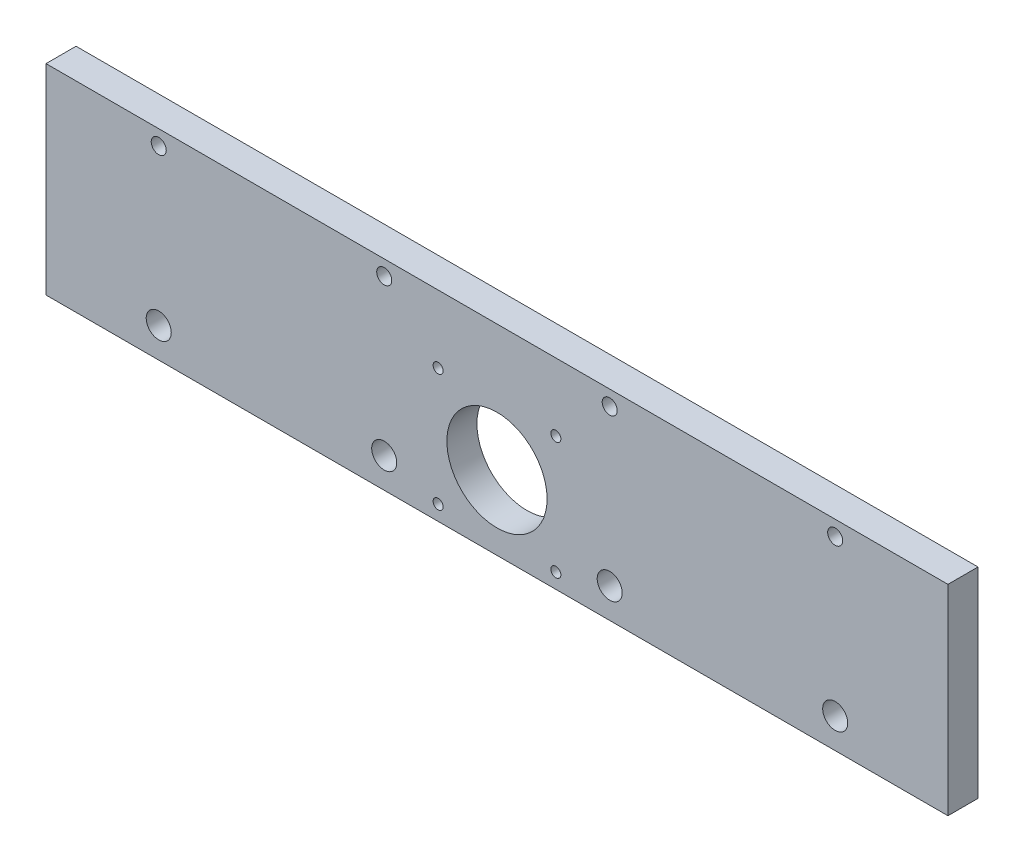
ISO-10303-21;
HEADER;
FILE_DESCRIPTION(('STEP AP214'),'2;1');
FILE_NAME('part.step','',(''),(''),'','','');
FILE_SCHEMA(('AUTOMOTIVE_DESIGN { 1 0 10303 214 1 1 1 1 }'));
ENDSEC;
DATA;
#1=APPLICATION_CONTEXT('core data for automotive mechanical design processes');
#2=APPLICATION_PROTOCOL_DEFINITION('international standard','automotive_design',2000,#1);
#3=PRODUCT_CONTEXT('',#1,'mechanical');
#4=PRODUCT('Part','Part','',(#3));
#5=PRODUCT_RELATED_PRODUCT_CATEGORY('part','',(#4));
#6=PRODUCT_DEFINITION_FORMATION('','',#4);
#7=PRODUCT_DEFINITION_CONTEXT('part definition',#1,'design');
#8=PRODUCT_DEFINITION('design','',#6,#7);
#9=PRODUCT_DEFINITION_SHAPE('','',#8);
#10=(LENGTH_UNIT() NAMED_UNIT(*) SI_UNIT(.MILLI.,.METRE.));
#11=(NAMED_UNIT(*) PLANE_ANGLE_UNIT() SI_UNIT($,.RADIAN.));
#12=(NAMED_UNIT(*) SI_UNIT($,.STERADIAN.) SOLID_ANGLE_UNIT());
#13=UNCERTAINTY_MEASURE_WITH_UNIT(LENGTH_MEASURE(1.E-05),#10,'distance_accuracy_value','');
#14=(GEOMETRIC_REPRESENTATION_CONTEXT(3) GLOBAL_UNCERTAINTY_ASSIGNED_CONTEXT((#13)) GLOBAL_UNIT_ASSIGNED_CONTEXT((#10,
#11,#12)) REPRESENTATION_CONTEXT('',''));
#15=CARTESIAN_POINT('',(0.,0.,0.));
#16=DIRECTION('',(0.,0.,1.));
#17=DIRECTION('',(1.,0.,0.));
#18=AXIS2_PLACEMENT_3D('',#15,#16,#17);
#19=CARTESIAN_POINT('',(180.,40.,12.));
#20=DIRECTION('',(0.,0.,-1.));
#21=DIRECTION('',(-1.,0.,0.));
#22=AXIS2_PLACEMENT_3D('',#19,#20,#21);
#23=PLANE('',#22);
#24=CARTESIAN_POINT('',(23.5,13.,12.));
#25=DIRECTION('',(0.,0.,-1.));
#26=DIRECTION('',(-1.,0.,0.));
#27=AXIS2_PLACEMENT_3D('',#24,#25,#26);
#28=CIRCLE('',#27,2.);
#29=CARTESIAN_POINT('',(21.5,13.,12.));
#30=VERTEX_POINT('',#29);
#31=EDGE_CURVE('E150',#30,#30,#28,.T.);
#32=ORIENTED_EDGE('',*,*,#31,.T.);
#33=EDGE_LOOP('',(#32));
#34=FACE_BOUND('',#33,.T.);
#35=CARTESIAN_POINT('',(-23.5,-34.,12.));
#36=DIRECTION('',(0.,0.,1.));
#37=DIRECTION('',(1.,0.,0.));
#38=AXIS2_PLACEMENT_3D('',#35,#36,#37);
#39=CIRCLE('',#38,2.00000000000001);
#40=CARTESIAN_POINT('',(-21.5,-34.,12.));
#41=VERTEX_POINT('',#40);
#42=EDGE_CURVE('E159',#41,#41,#39,.T.);
#43=ORIENTED_EDGE('',*,*,#42,.F.);
#44=EDGE_LOOP('',(#43));
#45=FACE_BOUND('',#44,.T.);
#46=CARTESIAN_POINT('',(-23.5,13.,12.));
#47=DIRECTION('',(0.,0.,1.));
#48=DIRECTION('',(1.,0.,0.));
#49=AXIS2_PLACEMENT_3D('',#46,#47,#48);
#50=CIRCLE('',#49,2.);
#51=CARTESIAN_POINT('',(-21.5,13.,12.));
#52=VERTEX_POINT('',#51);
#53=EDGE_CURVE('E165',#52,#52,#50,.T.);
#54=ORIENTED_EDGE('',*,*,#53,.F.);
#55=EDGE_LOOP('',(#54));
#56=FACE_BOUND('',#55,.T.);
#57=CARTESIAN_POINT('',(0.,-10.5,12.));
#58=DIRECTION('',(0.,0.,1.));
#59=DIRECTION('',(1.,0.,0.));
#60=AXIS2_PLACEMENT_3D('',#57,#58,#59);
#61=CIRCLE('',#60,20.);
#62=CARTESIAN_POINT('',(20.,-10.5,12.));
#63=VERTEX_POINT('',#62);
#64=EDGE_CURVE('E171',#63,#63,#61,.T.);
#65=ORIENTED_EDGE('',*,*,#64,.F.);
#66=EDGE_LOOP('',(#65));
#67=FACE_BOUND('',#66,.T.);
#68=CARTESIAN_POINT('',(45.,34.,12.));
#69=DIRECTION('',(0.,0.,1.));
#70=DIRECTION('',(1.,0.,0.));
#71=AXIS2_PLACEMENT_3D('',#68,#69,#70);
#72=CIRCLE('',#71,2.99999999999999);
#73=CARTESIAN_POINT('',(48.,34.,12.));
#74=VERTEX_POINT('',#73);
#75=EDGE_CURVE('E179',#74,#74,#72,.T.);
#76=ORIENTED_EDGE('',*,*,#75,.F.);
#77=EDGE_LOOP('',(#76));
#78=FACE_BOUND('',#77,.T.);
#79=CARTESIAN_POINT('',(45.,-28.,12.));
#80=DIRECTION('',(0.,0.,1.));
#81=DIRECTION('',(1.,0.,0.));
#82=AXIS2_PLACEMENT_3D('',#79,#80,#81);
#83=CIRCLE('',#82,4.99999999999999);
#84=CARTESIAN_POINT('',(50.,-28.,12.));
#85=VERTEX_POINT('',#84);
#86=EDGE_CURVE('E185',#85,#85,#83,.T.);
#87=ORIENTED_EDGE('',*,*,#86,.F.);
#88=EDGE_LOOP('',(#87));
#89=FACE_BOUND('',#88,.T.);
#90=CARTESIAN_POINT('',(135.,-28.,12.));
#91=DIRECTION('',(0.,0.,1.));
#92=DIRECTION('',(1.,0.,0.));
#93=AXIS2_PLACEMENT_3D('',#90,#91,#92);
#94=CIRCLE('',#93,4.99999999999999);
#95=CARTESIAN_POINT('',(140.,-28.,12.));
#96=VERTEX_POINT('',#95);
#97=EDGE_CURVE('E189',#96,#96,#94,.T.);
#98=ORIENTED_EDGE('',*,*,#97,.F.);
#99=EDGE_LOOP('',(#98));
#100=FACE_BOUND('',#99,.T.);
#101=CARTESIAN_POINT('',(135.,34.,12.));
#102=DIRECTION('',(0.,0.,1.));
#103=DIRECTION('',(1.,0.,0.));
#104=AXIS2_PLACEMENT_3D('',#101,#102,#103);
#105=CIRCLE('',#104,2.99999999999999);
#106=CARTESIAN_POINT('',(138.,34.,12.));
#107=VERTEX_POINT('',#106);
#108=EDGE_CURVE('E103',#107,#107,#105,.T.);
#109=ORIENTED_EDGE('',*,*,#108,.F.);
#110=EDGE_LOOP('',(#109));
#111=FACE_BOUND('',#110,.T.);
#112=DIRECTION('',(0.,1.,0.));
#113=VECTOR('',#112,1.);
#114=CARTESIAN_POINT('',(180.,-40.,12.));
#115=LINE('',#114,#113);
#116=CARTESIAN_POINT('',(180.,-40.,12.));
#117=VERTEX_POINT('',#116);
#118=CARTESIAN_POINT('',(180.,40.,12.));
#119=VERTEX_POINT('',#118);
#120=EDGE_CURVE('E85',#117,#119,#115,.T.);
#121=ORIENTED_EDGE('',*,*,#120,.T.);
#122=DIRECTION('',(-1.,0.,0.));
#123=VECTOR('',#122,1.);
#124=CARTESIAN_POINT('',(-180.,40.,12.));
#125=LINE('',#124,#123);
#126=CARTESIAN_POINT('',(-180.,40.,12.));
#127=VERTEX_POINT('',#126);
#128=EDGE_CURVE('E80',#119,#127,#125,.T.);
#129=ORIENTED_EDGE('',*,*,#128,.T.);
#130=DIRECTION('',(0.,-1.,0.));
#131=VECTOR('',#130,1.);
#132=CARTESIAN_POINT('',(-180.,-40.,12.));
#133=LINE('',#132,#131);
#134=CARTESIAN_POINT('',(-180.,-40.,12.));
#135=VERTEX_POINT('',#134);
#136=EDGE_CURVE('E83',#127,#135,#133,.T.);
#137=ORIENTED_EDGE('',*,*,#136,.T.);
#138=DIRECTION('',(1.,0.,0.));
#139=VECTOR('',#138,1.);
#140=CARTESIAN_POINT('',(-180.,-40.,12.));
#141=LINE('',#140,#139);
#142=EDGE_CURVE('E49',#135,#117,#141,.T.);
#143=ORIENTED_EDGE('',*,*,#142,.T.);
#144=EDGE_LOOP('',(#121,#129,#137,#143));
#145=FACE_BOUND('',#144,.T.);
#146=CARTESIAN_POINT('',(-45.,-28.,12.));
#147=DIRECTION('',(0.,0.,1.));
#148=DIRECTION('',(1.,0.,0.));
#149=AXIS2_PLACEMENT_3D('',#146,#147,#148);
#150=CIRCLE('',#149,4.99999999999999);
#151=CARTESIAN_POINT('',(-40.,-28.,12.));
#152=VERTEX_POINT('',#151);
#153=EDGE_CURVE('E113',#152,#152,#150,.T.);
#154=ORIENTED_EDGE('',*,*,#153,.F.);
#155=EDGE_LOOP('',(#154));
#156=FACE_BOUND('',#155,.T.);
#157=CARTESIAN_POINT('',(-135.,-28.,12.));
#158=DIRECTION('',(0.,0.,1.));
#159=DIRECTION('',(1.,0.,0.));
#160=AXIS2_PLACEMENT_3D('',#157,#158,#159);
#161=CIRCLE('',#160,4.99999999999999);
#162=CARTESIAN_POINT('',(-130.,-28.,12.));
#163=VERTEX_POINT('',#162);
#164=EDGE_CURVE('E119',#163,#163,#161,.T.);
#165=ORIENTED_EDGE('',*,*,#164,.F.);
#166=EDGE_LOOP('',(#165));
#167=FACE_BOUND('',#166,.T.);
#168=CARTESIAN_POINT('',(-45.,34.,12.));
#169=DIRECTION('',(0.,0.,1.));
#170=DIRECTION('',(1.,0.,0.));
#171=AXIS2_PLACEMENT_3D('',#168,#169,#170);
#172=CIRCLE('',#171,2.99999999999999);
#173=CARTESIAN_POINT('',(-42.,34.,12.));
#174=VERTEX_POINT('',#173);
#175=EDGE_CURVE('E125',#174,#174,#172,.T.);
#176=ORIENTED_EDGE('',*,*,#175,.F.);
#177=EDGE_LOOP('',(#176));
#178=FACE_BOUND('',#177,.T.);
#179=CARTESIAN_POINT('',(-135.,34.,12.));
#180=DIRECTION('',(0.,0.,1.));
#181=DIRECTION('',(1.,0.,0.));
#182=AXIS2_PLACEMENT_3D('',#179,#180,#181);
#183=CIRCLE('',#182,2.99999999999999);
#184=CARTESIAN_POINT('',(-132.,34.,12.));
#185=VERTEX_POINT('',#184);
#186=EDGE_CURVE('E11',#185,#185,#183,.T.);
#187=ORIENTED_EDGE('',*,*,#186,.F.);
#188=EDGE_LOOP('',(#187));
#189=FACE_BOUND('',#188,.T.);
#190=CARTESIAN_POINT('',(23.5,-34.,12.));
#191=DIRECTION('',(0.,0.,-1.));
#192=DIRECTION('',(-1.,0.,0.));
#193=AXIS2_PLACEMENT_3D('',#190,#191,#192);
#194=CIRCLE('',#193,2.00000000000001);
#195=CARTESIAN_POINT('',(21.5,-34.,12.));
#196=VERTEX_POINT('',#195);
#197=EDGE_CURVE('E145',#196,#196,#194,.T.);
#198=ORIENTED_EDGE('',*,*,#197,.T.);
#199=EDGE_LOOP('',(#198));
#200=FACE_BOUND('',#199,.T.);
#201=ADVANCED_FACE('F32',(#34,#45,#56,#67,#78,#89,#100,#111,#145,#156,#167,#178,#189,#200),#23,.F.);
#202=CARTESIAN_POINT('',(180.,40.,0.));
#203=DIRECTION('',(0.,0.,-1.));
#204=DIRECTION('',(-1.,0.,0.));
#205=AXIS2_PLACEMENT_3D('',#202,#203,#204);
#206=PLANE('',#205);
#207=CARTESIAN_POINT('',(23.5,13.,0.));
#208=DIRECTION('',(0.,0.,-1.));
#209=DIRECTION('',(-1.,0.,0.));
#210=AXIS2_PLACEMENT_3D('',#207,#208,#209);
#211=CIRCLE('',#210,2.);
#212=CARTESIAN_POINT('',(21.5,13.,0.));
#213=VERTEX_POINT('',#212);
#214=EDGE_CURVE('E155',#213,#213,#211,.T.);
#215=ORIENTED_EDGE('',*,*,#214,.F.);
#216=EDGE_LOOP('',(#215));
#217=FACE_BOUND('',#216,.T.);
#218=CARTESIAN_POINT('',(-23.5,-34.,0.));
#219=DIRECTION('',(0.,0.,-1.));
#220=DIRECTION('',(-1.,0.,0.));
#221=AXIS2_PLACEMENT_3D('',#218,#219,#220);
#222=CIRCLE('',#221,2.00000000000001);
#223=CARTESIAN_POINT('',(-25.5,-34.,0.));
#224=VERTEX_POINT('',#223);
#225=EDGE_CURVE('E158',#224,#224,#222,.F.);
#226=ORIENTED_EDGE('',*,*,#225,.T.);
#227=EDGE_LOOP('',(#226));
#228=FACE_BOUND('',#227,.T.);
#229=CARTESIAN_POINT('',(-23.5,13.,0.));
#230=DIRECTION('',(0.,0.,-1.));
#231=DIRECTION('',(-1.,0.,0.));
#232=AXIS2_PLACEMENT_3D('',#229,#230,#231);
#233=CIRCLE('',#232,2.);
#234=CARTESIAN_POINT('',(-25.5,13.,0.));
#235=VERTEX_POINT('',#234);
#236=EDGE_CURVE('E162',#235,#235,#233,.F.);
#237=ORIENTED_EDGE('',*,*,#236,.T.);
#238=EDGE_LOOP('',(#237));
#239=FACE_BOUND('',#238,.T.);
#240=CARTESIAN_POINT('',(0.,-10.5,0.));
#241=DIRECTION('',(0.,0.,-1.));
#242=DIRECTION('',(-1.,0.,0.));
#243=AXIS2_PLACEMENT_3D('',#240,#241,#242);
#244=CIRCLE('',#243,20.);
#245=CARTESIAN_POINT('',(-20.,-10.5,0.));
#246=VERTEX_POINT('',#245);
#247=EDGE_CURVE('E168',#246,#246,#244,.F.);
#248=ORIENTED_EDGE('',*,*,#247,.T.);
#249=EDGE_LOOP('',(#248));
#250=FACE_BOUND('',#249,.T.);
#251=CARTESIAN_POINT('',(45.,34.,0.));
#252=DIRECTION('',(0.,0.,-1.));
#253=DIRECTION('',(-1.,0.,0.));
#254=AXIS2_PLACEMENT_3D('',#251,#252,#253);
#255=CIRCLE('',#254,2.99999999999999);
#256=CARTESIAN_POINT('',(42.,34.,0.));
#257=VERTEX_POINT('',#256);
#258=EDGE_CURVE('E174',#257,#257,#255,.F.);
#259=ORIENTED_EDGE('',*,*,#258,.T.);
#260=EDGE_LOOP('',(#259));
#261=FACE_BOUND('',#260,.T.);
#262=CARTESIAN_POINT('',(45.,-28.,0.));
#263=DIRECTION('',(0.,0.,-1.));
#264=DIRECTION('',(-1.,0.,0.));
#265=AXIS2_PLACEMENT_3D('',#262,#263,#264);
#266=CIRCLE('',#265,4.99999999999999);
#267=CARTESIAN_POINT('',(40.,-28.,0.));
#268=VERTEX_POINT('',#267);
#269=EDGE_CURVE('E182',#268,#268,#266,.F.);
#270=ORIENTED_EDGE('',*,*,#269,.T.);
#271=EDGE_LOOP('',(#270));
#272=FACE_BOUND('',#271,.T.);
#273=CARTESIAN_POINT('',(135.,-28.,0.));
#274=DIRECTION('',(0.,0.,-1.));
#275=DIRECTION('',(-1.,0.,0.));
#276=AXIS2_PLACEMENT_3D('',#273,#274,#275);
#277=CIRCLE('',#276,4.99999999999999);
#278=CARTESIAN_POINT('',(130.,-28.,0.));
#279=VERTEX_POINT('',#278);
#280=EDGE_CURVE('E188',#279,#279,#277,.F.);
#281=ORIENTED_EDGE('',*,*,#280,.T.);
#282=EDGE_LOOP('',(#281));
#283=FACE_BOUND('',#282,.T.);
#284=CARTESIAN_POINT('',(135.,34.,0.));
#285=DIRECTION('',(0.,0.,-1.));
#286=DIRECTION('',(-1.,0.,0.));
#287=AXIS2_PLACEMENT_3D('',#284,#285,#286);
#288=CIRCLE('',#287,2.99999999999999);
#289=CARTESIAN_POINT('',(132.,34.,0.));
#290=VERTEX_POINT('',#289);
#291=EDGE_CURVE('E192',#290,#290,#288,.F.);
#292=ORIENTED_EDGE('',*,*,#291,.T.);
#293=EDGE_LOOP('',(#292));
#294=FACE_BOUND('',#293,.T.);
#295=DIRECTION('',(0.,1.,0.));
#296=VECTOR('',#295,1.);
#297=CARTESIAN_POINT('',(180.,-40.,0.));
#298=LINE('',#297,#296);
#299=CARTESIAN_POINT('',(180.,-40.,0.));
#300=VERTEX_POINT('',#299);
#301=CARTESIAN_POINT('',(180.,40.,0.));
#302=VERTEX_POINT('',#301);
#303=EDGE_CURVE('E100',#300,#302,#298,.T.);
#304=ORIENTED_EDGE('',*,*,#303,.F.);
#305=DIRECTION('',(1.,0.,0.));
#306=VECTOR('',#305,1.);
#307=CARTESIAN_POINT('',(-180.,-40.,0.));
#308=LINE('',#307,#306);
#309=CARTESIAN_POINT('',(-180.,-40.,0.));
#310=VERTEX_POINT('',#309);
#311=EDGE_CURVE('E72',#310,#300,#308,.T.);
#312=ORIENTED_EDGE('',*,*,#311,.F.);
#313=DIRECTION('',(0.,-1.,0.));
#314=VECTOR('',#313,1.);
#315=CARTESIAN_POINT('',(-180.,-40.,0.));
#316=LINE('',#315,#314);
#317=CARTESIAN_POINT('',(-180.,40.,0.));
#318=VERTEX_POINT('',#317);
#319=EDGE_CURVE('E66',#318,#310,#316,.T.);
#320=ORIENTED_EDGE('',*,*,#319,.F.);
#321=DIRECTION('',(-1.,0.,0.));
#322=VECTOR('',#321,1.);
#323=CARTESIAN_POINT('',(-180.,40.,0.));
#324=LINE('',#323,#322);
#325=EDGE_CURVE('E90',#302,#318,#324,.T.);
#326=ORIENTED_EDGE('',*,*,#325,.F.);
#327=EDGE_LOOP('',(#304,#312,#320,#326));
#328=FACE_BOUND('',#327,.T.);
#329=CARTESIAN_POINT('',(-45.,-28.,0.));
#330=DIRECTION('',(0.,0.,-1.));
#331=DIRECTION('',(-1.,0.,0.));
#332=AXIS2_PLACEMENT_3D('',#329,#330,#331);
#333=CIRCLE('',#332,4.99999999999999);
#334=CARTESIAN_POINT('',(-50.,-28.,0.));
#335=VERTEX_POINT('',#334);
#336=EDGE_CURVE('E110',#335,#335,#333,.F.);
#337=ORIENTED_EDGE('',*,*,#336,.T.);
#338=EDGE_LOOP('',(#337));
#339=FACE_BOUND('',#338,.T.);
#340=CARTESIAN_POINT('',(-135.,-28.,0.));
#341=DIRECTION('',(0.,0.,-1.));
#342=DIRECTION('',(-1.,0.,0.));
#343=AXIS2_PLACEMENT_3D('',#340,#341,#342);
#344=CIRCLE('',#343,4.99999999999999);
#345=CARTESIAN_POINT('',(-140.,-28.,0.));
#346=VERTEX_POINT('',#345);
#347=EDGE_CURVE('E116',#346,#346,#344,.F.);
#348=ORIENTED_EDGE('',*,*,#347,.T.);
#349=EDGE_LOOP('',(#348));
#350=FACE_BOUND('',#349,.T.);
#351=CARTESIAN_POINT('',(-45.,34.,0.));
#352=DIRECTION('',(0.,0.,-1.));
#353=DIRECTION('',(-1.,0.,0.));
#354=AXIS2_PLACEMENT_3D('',#351,#352,#353);
#355=CIRCLE('',#354,2.99999999999999);
#356=CARTESIAN_POINT('',(-48.,34.,0.));
#357=VERTEX_POINT('',#356);
#358=EDGE_CURVE('E122',#357,#357,#355,.F.);
#359=ORIENTED_EDGE('',*,*,#358,.T.);
#360=EDGE_LOOP('',(#359));
#361=FACE_BOUND('',#360,.T.);
#362=CARTESIAN_POINT('',(-135.,34.,0.));
#363=DIRECTION('',(0.,0.,-1.));
#364=DIRECTION('',(-1.,0.,0.));
#365=AXIS2_PLACEMENT_3D('',#362,#363,#364);
#366=CIRCLE('',#365,2.99999999999999);
#367=CARTESIAN_POINT('',(-138.,34.,0.));
#368=VERTEX_POINT('',#367);
#369=EDGE_CURVE('E41',#368,#368,#366,.F.);
#370=ORIENTED_EDGE('',*,*,#369,.T.);
#371=EDGE_LOOP('',(#370));
#372=FACE_BOUND('',#371,.T.);
#373=CARTESIAN_POINT('',(23.5,-34.,0.));
#374=DIRECTION('',(0.,0.,-1.));
#375=DIRECTION('',(-1.,0.,0.));
#376=AXIS2_PLACEMENT_3D('',#373,#374,#375);
#377=CIRCLE('',#376,2.00000000000001);
#378=CARTESIAN_POINT('',(21.5,-34.,0.));
#379=VERTEX_POINT('',#378);
#380=EDGE_CURVE('E147',#379,#379,#377,.T.);
#381=ORIENTED_EDGE('',*,*,#380,.F.);
#382=EDGE_LOOP('',(#381));
#383=FACE_BOUND('',#382,.T.);
#384=ADVANCED_FACE('F130',(#217,#228,#239,#250,#261,#272,#283,#294,#328,#339,#350,#361,#372,
#383),#206,.T.);
#385=CARTESIAN_POINT('',(180.,-40.,12.));
#386=DIRECTION('',(-1.,0.,0.));
#387=DIRECTION('',(0.,0.,1.));
#388=AXIS2_PLACEMENT_3D('',#385,#386,#387);
#389=PLANE('',#388);
#390=ORIENTED_EDGE('',*,*,#303,.T.);
#391=DIRECTION('',(0.,0.,-1.));
#392=VECTOR('',#391,1.);
#393=CARTESIAN_POINT('',(180.,40.,12.));
#394=LINE('',#393,#392);
#395=EDGE_CURVE('E91',#119,#302,#394,.T.);
#396=ORIENTED_EDGE('',*,*,#395,.F.);
#397=ORIENTED_EDGE('',*,*,#120,.F.);
#398=DIRECTION('',(0.,0.,-1.));
#399=VECTOR('',#398,1.);
#400=CARTESIAN_POINT('',(180.,-40.,12.));
#401=LINE('',#400,#399);
#402=EDGE_CURVE('E96',#117,#300,#401,.T.);
#403=ORIENTED_EDGE('',*,*,#402,.T.);
#404=EDGE_LOOP('',(#390,#396,#397,#403));
#405=FACE_BOUND('',#404,.T.);
#406=ADVANCED_FACE('F222',(#405),#389,.F.);
#407=CARTESIAN_POINT('',(-180.,40.,12.));
#408=DIRECTION('',(0.,-1.,0.));
#409=DIRECTION('',(0.,0.,-1.));
#410=AXIS2_PLACEMENT_3D('',#407,#408,#409);
#411=PLANE('',#410);
#412=ORIENTED_EDGE('',*,*,#325,.T.);
#413=DIRECTION('',(0.,0.,-1.));
#414=VECTOR('',#413,1.);
#415=CARTESIAN_POINT('',(-180.,40.,12.));
#416=LINE('',#415,#414);
#417=EDGE_CURVE('E88',#127,#318,#416,.T.);
#418=ORIENTED_EDGE('',*,*,#417,.F.);
#419=ORIENTED_EDGE('',*,*,#128,.F.);
#420=ORIENTED_EDGE('',*,*,#395,.T.);
#421=EDGE_LOOP('',(#412,#418,#419,#420));
#422=FACE_BOUND('',#421,.T.);
#423=ADVANCED_FACE('F89',(#422),#411,.F.);
#424=CARTESIAN_POINT('',(-180.,-40.,12.));
#425=DIRECTION('',(1.,0.,0.));
#426=DIRECTION('',(0.,0.,-1.));
#427=AXIS2_PLACEMENT_3D('',#424,#425,#426);
#428=PLANE('',#427);
#429=ORIENTED_EDGE('',*,*,#319,.T.);
#430=DIRECTION('',(0.,0.,-1.));
#431=VECTOR('',#430,1.);
#432=CARTESIAN_POINT('',(-180.,-40.,12.));
#433=LINE('',#432,#431);
#434=EDGE_CURVE('E92',#135,#310,#433,.T.);
#435=ORIENTED_EDGE('',*,*,#434,.F.);
#436=ORIENTED_EDGE('',*,*,#136,.F.);
#437=ORIENTED_EDGE('',*,*,#417,.T.);
#438=EDGE_LOOP('',(#429,#435,#436,#437));
#439=FACE_BOUND('',#438,.T.);
#440=ADVANCED_FACE('F94',(#439),#428,.F.);
#441=CARTESIAN_POINT('',(-180.,-40.,12.));
#442=DIRECTION('',(0.,1.,0.));
#443=DIRECTION('',(0.,0.,1.));
#444=AXIS2_PLACEMENT_3D('',#441,#442,#443);
#445=PLANE('',#444);
#446=ORIENTED_EDGE('',*,*,#311,.T.);
#447=ORIENTED_EDGE('',*,*,#402,.F.);
#448=ORIENTED_EDGE('',*,*,#142,.F.);
#449=ORIENTED_EDGE('',*,*,#434,.T.);
#450=EDGE_LOOP('',(#446,#447,#448,#449));
#451=FACE_BOUND('',#450,.T.);
#452=ADVANCED_FACE('F206',(#451),#445,.F.);
#453=CARTESIAN_POINT('',(135.,34.,-0.000999999999999265));
#454=DIRECTION('',(0.,0.,1.));
#455=DIRECTION('',(1.,0.,0.));
#456=AXIS2_PLACEMENT_3D('',#453,#454,#455);
#457=CYLINDRICAL_SURFACE('',#456,2.99999999999999);
#458=ORIENTED_EDGE('',*,*,#291,.F.);
#459=EDGE_LOOP('',(#458));
#460=FACE_BOUND('',#459,.T.);
#461=ORIENTED_EDGE('',*,*,#108,.T.);
#462=EDGE_LOOP('',(#461));
#463=FACE_BOUND('',#462,.T.);
#464=ADVANCED_FACE('F202',(#460,#463),#457,.F.);
#465=CARTESIAN_POINT('',(135.,-28.,-0.000999999999999265));
#466=DIRECTION('',(0.,0.,1.));
#467=DIRECTION('',(1.,0.,0.));
#468=AXIS2_PLACEMENT_3D('',#465,#466,#467);
#469=CYLINDRICAL_SURFACE('',#468,4.99999999999999);
#470=ORIENTED_EDGE('',*,*,#280,.F.);
#471=EDGE_LOOP('',(#470));
#472=FACE_BOUND('',#471,.T.);
#473=ORIENTED_EDGE('',*,*,#97,.T.);
#474=EDGE_LOOP('',(#473));
#475=FACE_BOUND('',#474,.T.);
#476=ADVANCED_FACE('F205',(#472,#475),#469,.F.);
#477=CARTESIAN_POINT('',(45.,-28.,-0.000999999999999265));
#478=DIRECTION('',(0.,0.,1.));
#479=DIRECTION('',(1.,0.,0.));
#480=AXIS2_PLACEMENT_3D('',#477,#478,#479);
#481=CYLINDRICAL_SURFACE('',#480,4.99999999999999);
#482=ORIENTED_EDGE('',*,*,#269,.F.);
#483=EDGE_LOOP('',(#482));
#484=FACE_BOUND('',#483,.T.);
#485=ORIENTED_EDGE('',*,*,#86,.T.);
#486=EDGE_LOOP('',(#485));
#487=FACE_BOUND('',#486,.T.);
#488=ADVANCED_FACE('F214',(#484,#487),#481,.F.);
#489=CARTESIAN_POINT('',(-45.,-28.,-0.000999999999999265));
#490=DIRECTION('',(0.,0.,1.));
#491=DIRECTION('',(1.,0.,0.));
#492=AXIS2_PLACEMENT_3D('',#489,#490,#491);
#493=CYLINDRICAL_SURFACE('',#492,4.99999999999999);
#494=ORIENTED_EDGE('',*,*,#336,.F.);
#495=EDGE_LOOP('',(#494));
#496=FACE_BOUND('',#495,.T.);
#497=ORIENTED_EDGE('',*,*,#153,.T.);
#498=EDGE_LOOP('',(#497));
#499=FACE_BOUND('',#498,.T.);
#500=ADVANCED_FACE('F232',(#496,#499),#493,.F.);
#501=CARTESIAN_POINT('',(-135.,-28.,-0.000999999999999265));
#502=DIRECTION('',(0.,0.,1.));
#503=DIRECTION('',(1.,0.,0.));
#504=AXIS2_PLACEMENT_3D('',#501,#502,#503);
#505=CYLINDRICAL_SURFACE('',#504,4.99999999999999);
#506=ORIENTED_EDGE('',*,*,#347,.F.);
#507=EDGE_LOOP('',(#506));
#508=FACE_BOUND('',#507,.T.);
#509=ORIENTED_EDGE('',*,*,#164,.T.);
#510=EDGE_LOOP('',(#509));
#511=FACE_BOUND('',#510,.T.);
#512=ADVANCED_FACE('F235',(#508,#511),#505,.F.);
#513=CARTESIAN_POINT('',(45.,34.,-0.000999999999999265));
#514=DIRECTION('',(0.,0.,1.));
#515=DIRECTION('',(1.,0.,0.));
#516=AXIS2_PLACEMENT_3D('',#513,#514,#515);
#517=CYLINDRICAL_SURFACE('',#516,2.99999999999999);
#518=ORIENTED_EDGE('',*,*,#258,.F.);
#519=EDGE_LOOP('',(#518));
#520=FACE_BOUND('',#519,.T.);
#521=ORIENTED_EDGE('',*,*,#75,.T.);
#522=EDGE_LOOP('',(#521));
#523=FACE_BOUND('',#522,.T.);
#524=ADVANCED_FACE('F238',(#520,#523),#517,.F.);
#525=CARTESIAN_POINT('',(-45.,34.,-0.000999999999999265));
#526=DIRECTION('',(0.,0.,1.));
#527=DIRECTION('',(1.,0.,0.));
#528=AXIS2_PLACEMENT_3D('',#525,#526,#527);
#529=CYLINDRICAL_SURFACE('',#528,2.99999999999999);
#530=ORIENTED_EDGE('',*,*,#358,.F.);
#531=EDGE_LOOP('',(#530));
#532=FACE_BOUND('',#531,.T.);
#533=ORIENTED_EDGE('',*,*,#175,.T.);
#534=EDGE_LOOP('',(#533));
#535=FACE_BOUND('',#534,.T.);
#536=ADVANCED_FACE('F136',(#532,#535),#529,.F.);
#537=CARTESIAN_POINT('',(-135.,34.,-0.000999999999999265));
#538=DIRECTION('',(0.,0.,1.));
#539=DIRECTION('',(1.,0.,0.));
#540=AXIS2_PLACEMENT_3D('',#537,#538,#539);
#541=CYLINDRICAL_SURFACE('',#540,2.99999999999999);
#542=ORIENTED_EDGE('',*,*,#369,.F.);
#543=EDGE_LOOP('',(#542));
#544=FACE_BOUND('',#543,.T.);
#545=ORIENTED_EDGE('',*,*,#186,.T.);
#546=EDGE_LOOP('',(#545));
#547=FACE_BOUND('',#546,.T.);
#548=ADVANCED_FACE('F34',(#544,#547),#541,.F.);
#549=CARTESIAN_POINT('',(0.,-10.5,-0.000999999999999265));
#550=DIRECTION('',(0.,0.,1.));
#551=DIRECTION('',(1.,0.,0.));
#552=AXIS2_PLACEMENT_3D('',#549,#550,#551);
#553=CYLINDRICAL_SURFACE('',#552,20.);
#554=ORIENTED_EDGE('',*,*,#247,.F.);
#555=EDGE_LOOP('',(#554));
#556=FACE_BOUND('',#555,.T.);
#557=ORIENTED_EDGE('',*,*,#64,.T.);
#558=EDGE_LOOP('',(#557));
#559=FACE_BOUND('',#558,.T.);
#560=ADVANCED_FACE('F135',(#556,#559),#553,.F.);
#561=CARTESIAN_POINT('',(-23.5,13.,-0.000999999999999265));
#562=DIRECTION('',(0.,0.,1.));
#563=DIRECTION('',(1.,0.,0.));
#564=AXIS2_PLACEMENT_3D('',#561,#562,#563);
#565=CYLINDRICAL_SURFACE('',#564,2.);
#566=ORIENTED_EDGE('',*,*,#236,.F.);
#567=EDGE_LOOP('',(#566));
#568=FACE_BOUND('',#567,.T.);
#569=ORIENTED_EDGE('',*,*,#53,.T.);
#570=EDGE_LOOP('',(#569));
#571=FACE_BOUND('',#570,.T.);
#572=ADVANCED_FACE('F305',(#568,#571),#565,.F.);
#573=CARTESIAN_POINT('',(-23.5,-34.,-0.000999999999999265));
#574=DIRECTION('',(0.,0.,1.));
#575=DIRECTION('',(1.,0.,0.));
#576=AXIS2_PLACEMENT_3D('',#573,#574,#575);
#577=CYLINDRICAL_SURFACE('',#576,2.00000000000001);
#578=ORIENTED_EDGE('',*,*,#225,.F.);
#579=EDGE_LOOP('',(#578));
#580=FACE_BOUND('',#579,.T.);
#581=ORIENTED_EDGE('',*,*,#42,.T.);
#582=EDGE_LOOP('',(#581));
#583=FACE_BOUND('',#582,.T.);
#584=ADVANCED_FACE('F314',(#580,#583),#577,.F.);
#585=CARTESIAN_POINT('',(23.5,13.,-0.000999999999999265));
#586=DIRECTION('',(0.,0.,1.));
#587=DIRECTION('',(1.,0.,0.));
#588=AXIS2_PLACEMENT_3D('',#585,#586,#587);
#589=CYLINDRICAL_SURFACE('',#588,2.);
#590=ORIENTED_EDGE('',*,*,#214,.T.);
#591=EDGE_LOOP('',(#590));
#592=FACE_BOUND('',#591,.T.);
#593=ORIENTED_EDGE('',*,*,#31,.F.);
#594=EDGE_LOOP('',(#593));
#595=FACE_BOUND('',#594,.T.);
#596=ADVANCED_FACE('F322',(#592,#595),#589,.F.);
#597=CARTESIAN_POINT('',(23.5,-34.,-0.000999999999999265));
#598=DIRECTION('',(0.,0.,1.));
#599=DIRECTION('',(1.,0.,0.));
#600=AXIS2_PLACEMENT_3D('',#597,#598,#599);
#601=CYLINDRICAL_SURFACE('',#600,2.00000000000001);
#602=ORIENTED_EDGE('',*,*,#380,.T.);
#603=EDGE_LOOP('',(#602));
#604=FACE_BOUND('',#603,.T.);
#605=ORIENTED_EDGE('',*,*,#197,.F.);
#606=EDGE_LOOP('',(#605));
#607=FACE_BOUND('',#606,.T.);
#608=ADVANCED_FACE('F340',(#604,#607),#601,.F.);
#609=CLOSED_SHELL('',(#201,#384,#406,#423,#440,#452,#464,#476,#488,#500,#512,#524,#536,#548,
#560,#572,#584,#596,#608));
#610=MANIFOLD_SOLID_BREP('B2',#609);
#611=ADVANCED_BREP_SHAPE_REPRESENTATION('',(#18,#610),#14);
#612=SHAPE_DEFINITION_REPRESENTATION(#9,#611);
ENDSEC;
END-ISO-10303-21;
